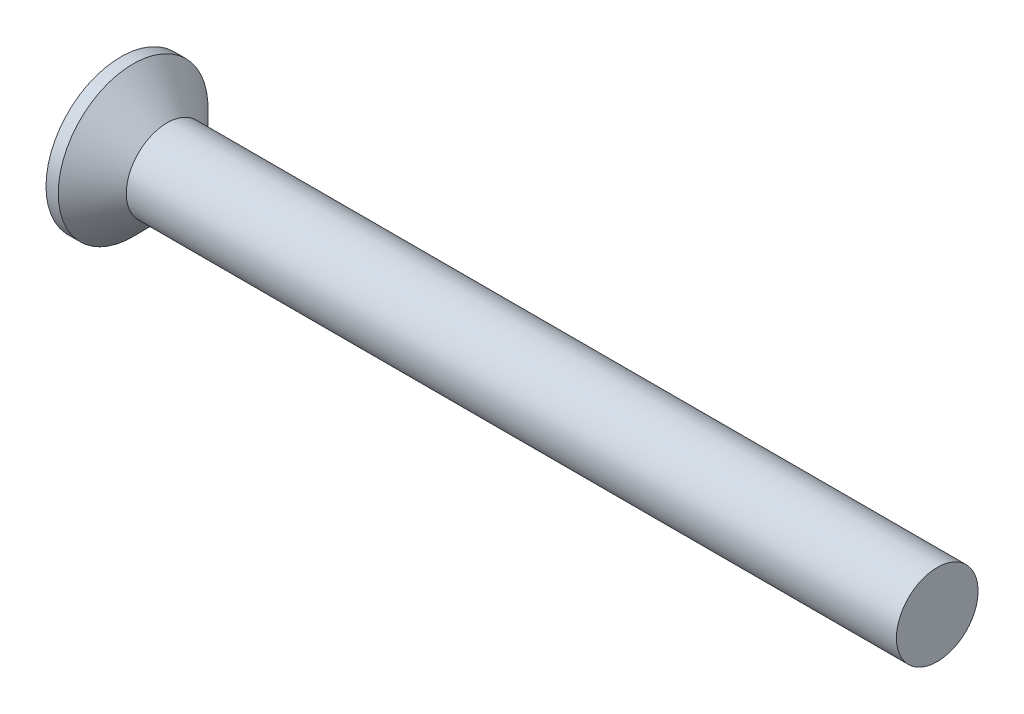
ISO-10303-21;
HEADER;
FILE_DESCRIPTION(('STEP AP214'),'2;1');
FILE_NAME('part.step','',(''),(''),'','','');
FILE_SCHEMA(('AUTOMOTIVE_DESIGN { 1 0 10303 214 1 1 1 1 }'));
ENDSEC;
DATA;
#1=APPLICATION_CONTEXT('core data for automotive mechanical design processes');
#2=APPLICATION_PROTOCOL_DEFINITION('international standard','automotive_design',2000,#1);
#3=PRODUCT_CONTEXT('',#1,'mechanical');
#4=PRODUCT('Part','Part','',(#3));
#5=PRODUCT_RELATED_PRODUCT_CATEGORY('part','',(#4));
#6=PRODUCT_DEFINITION_FORMATION('','',#4);
#7=PRODUCT_DEFINITION_CONTEXT('part definition',#1,'design');
#8=PRODUCT_DEFINITION('design','',#6,#7);
#9=PRODUCT_DEFINITION_SHAPE('','',#8);
#10=(LENGTH_UNIT() NAMED_UNIT(*) SI_UNIT(.MILLI.,.METRE.));
#11=(NAMED_UNIT(*) PLANE_ANGLE_UNIT() SI_UNIT($,.RADIAN.));
#12=(NAMED_UNIT(*) SI_UNIT($,.STERADIAN.) SOLID_ANGLE_UNIT());
#13=UNCERTAINTY_MEASURE_WITH_UNIT(LENGTH_MEASURE(1.E-05),#10,'distance_accuracy_value','');
#14=(GEOMETRIC_REPRESENTATION_CONTEXT(3) GLOBAL_UNCERTAINTY_ASSIGNED_CONTEXT((#13)) GLOBAL_UNIT_ASSIGNED_CONTEXT((#10,
#11,#12)) REPRESENTATION_CONTEXT('',''));
#15=CARTESIAN_POINT('',(0.,0.,0.));
#16=DIRECTION('',(0.,0.,1.));
#17=DIRECTION('',(1.,0.,0.));
#18=AXIS2_PLACEMENT_3D('',#15,#16,#17);
#19=CARTESIAN_POINT('',(0.,0.,0.));
#20=DIRECTION('',(-1.,0.,0.));
#21=DIRECTION('',(0.,0.,1.));
#22=AXIS2_PLACEMENT_3D('',#19,#20,#21);
#23=PLANE('',#22);
#24=CARTESIAN_POINT('',(0.,0.,0.));
#25=DIRECTION('',(-1.,0.,0.));
#26=DIRECTION('',(0.,0.,1.));
#27=AXIS2_PLACEMENT_3D('',#24,#25,#26);
#28=CIRCLE('',#27,2.75);
#29=CARTESIAN_POINT('',(0.,0.,2.75));
#30=VERTEX_POINT('',#29);
#31=EDGE_CURVE('E46',#30,#30,#28,.T.);
#32=ORIENTED_EDGE('',*,*,#31,.T.);
#33=EDGE_LOOP('',(#32));
#34=FACE_BOUND('',#33,.T.);
#35=DIRECTION('',(0.,1.,0.));
#36=VECTOR('',#35,1.);
#37=CARTESIAN_POINT('',(0.,-1.55,-0.395));
#38=LINE('',#37,#36);
#39=CARTESIAN_POINT('',(0.,-1.55,-0.395));
#40=VERTEX_POINT('',#39);
#41=CARTESIAN_POINT('',(0.,-0.394999999999999,-0.395));
#42=VERTEX_POINT('',#41);
#43=EDGE_CURVE('E107',#40,#42,#38,.T.);
#44=ORIENTED_EDGE('',*,*,#43,.T.);
#45=DIRECTION('',(0.,0.,-1.));
#46=VECTOR('',#45,1.);
#47=CARTESIAN_POINT('',(0.,-0.395000000000005,1.55));
#48=LINE('',#47,#46);
#49=CARTESIAN_POINT('',(0.,-0.394999999999995,-1.55));
#50=VERTEX_POINT('',#49);
#51=EDGE_CURVE('E87',#42,#50,#48,.T.);
#52=ORIENTED_EDGE('',*,*,#51,.T.);
#53=DIRECTION('',(0.,1.,0.));
#54=VECTOR('',#53,1.);
#55=CARTESIAN_POINT('',(0.,-0.394999999999995,-1.55));
#56=LINE('',#55,#54);
#57=CARTESIAN_POINT('',(0.,0.395000000000005,-1.55));
#58=VERTEX_POINT('',#57);
#59=EDGE_CURVE('E380',#50,#58,#56,.T.);
#60=ORIENTED_EDGE('',*,*,#59,.T.);
#61=DIRECTION('',(0.,0.,1.));
#62=VECTOR('',#61,1.);
#63=CARTESIAN_POINT('',(0.,0.395000000000005,-1.55));
#64=LINE('',#63,#62);
#65=CARTESIAN_POINT('',(0.,0.395000000000001,-0.395));
#66=VERTEX_POINT('',#65);
#67=EDGE_CURVE('E103',#58,#66,#64,.T.);
#68=ORIENTED_EDGE('',*,*,#67,.T.);
#69=CARTESIAN_POINT('',(0.,1.55,-0.395));
#70=VERTEX_POINT('',#69);
#71=EDGE_CURVE('E97',#66,#70,#38,.T.);
#72=ORIENTED_EDGE('',*,*,#71,.T.);
#73=DIRECTION('',(0.,0.,1.));
#74=VECTOR('',#73,1.);
#75=CARTESIAN_POINT('',(0.,1.55,-0.395));
#76=LINE('',#75,#74);
#77=CARTESIAN_POINT('',(0.,1.55,0.395));
#78=VERTEX_POINT('',#77);
#79=EDGE_CURVE('E100',#70,#78,#76,.T.);
#80=ORIENTED_EDGE('',*,*,#79,.T.);
#81=DIRECTION('',(0.,-1.,0.));
#82=VECTOR('',#81,1.);
#83=CARTESIAN_POINT('',(0.,1.55,0.395));
#84=LINE('',#83,#82);
#85=CARTESIAN_POINT('',(0.,0.394999999999998,0.395));
#86=VERTEX_POINT('',#85);
#87=EDGE_CURVE('E392',#78,#86,#84,.T.);
#88=ORIENTED_EDGE('',*,*,#87,.T.);
#89=CARTESIAN_POINT('',(0.,0.394999999999994,1.55));
#90=VERTEX_POINT('',#89);
#91=EDGE_CURVE('E375',#86,#90,#64,.T.);
#92=ORIENTED_EDGE('',*,*,#91,.T.);
#93=DIRECTION('',(0.,-1.,0.));
#94=VECTOR('',#93,1.);
#95=CARTESIAN_POINT('',(0.,0.394999999999994,1.55));
#96=LINE('',#95,#94);
#97=CARTESIAN_POINT('',(0.,-0.395000000000005,1.55));
#98=VERTEX_POINT('',#97);
#99=EDGE_CURVE('E361',#90,#98,#96,.T.);
#100=ORIENTED_EDGE('',*,*,#99,.T.);
#101=CARTESIAN_POINT('',(0.,-0.395000000000001,0.395));
#102=VERTEX_POINT('',#101);
#103=EDGE_CURVE('E373',#98,#102,#48,.T.);
#104=ORIENTED_EDGE('',*,*,#103,.T.);
#105=CARTESIAN_POINT('',(0.,-1.55,0.395));
#106=VERTEX_POINT('',#105);
#107=EDGE_CURVE('E113',#102,#106,#84,.T.);
#108=ORIENTED_EDGE('',*,*,#107,.T.);
#109=DIRECTION('',(0.,0.,-1.));
#110=VECTOR('',#109,1.);
#111=CARTESIAN_POINT('',(0.,-1.55,0.395));
#112=LINE('',#111,#110);
#113=EDGE_CURVE('E136',#106,#40,#112,.T.);
#114=ORIENTED_EDGE('',*,*,#113,.T.);
#115=EDGE_LOOP('',(#44,#52,#60,#68,#72,#80,#88,#92,#100,#104,#108,#114));
#116=FACE_BOUND('',#115,.T.);
#117=ADVANCED_FACE('F39',(#34,#116),#23,.T.);
#118=CARTESIAN_POINT('',(2.38373382624769,0.,0.16865988909427));
#119=DIRECTION('',(-0.0945267588569115,0.,-0.995522321125954));
#120=DIRECTION('',(-0.995522321125954,0.,0.0945267588569115));
#121=AXIS2_PLACEMENT_3D('',#118,#119,#120);
#122=PLANE('',#121);
#123=ORIENTED_EDGE('',*,*,#107,.F.);
#124=DIRECTION('',(0.991104257398676,0.0941072552097304,-0.0941072552097301));
#125=VECTOR('',#124,1.);
#126=CARTESIAN_POINT('',(2.39946475118715,-0.16716620751949,0.167166207519489));
#127=LINE('',#126,#125);
#128=CARTESIAN_POINT('',(2.08,-0.197500000000001,0.197499999999999));
#129=VERTEX_POINT('',#128);
#130=EDGE_CURVE('E131',#102,#129,#127,.T.);
#131=ORIENTED_EDGE('',*,*,#130,.T.);
#132=DIRECTION('',(0.835707904588477,0.543411029305728,-0.0793520726712617));
#133=VECTOR('',#132,1.);
#134=CARTESIAN_POINT('',(0.,-1.55,0.395));
#135=LINE('',#134,#133);
#136=EDGE_CURVE('E108',#106,#129,#135,.T.);
#137=ORIENTED_EDGE('',*,*,#136,.F.);
#138=EDGE_LOOP('',(#123,#131,#137));
#139=FACE_BOUND('',#138,.T.);
#140=ADVANCED_FACE('F159',(#139),#122,.T.);
#141=DIRECTION('',(0.835707904588477,-0.543411029305729,-0.0793520726712616));
#142=VECTOR('',#141,1.);
#143=CARTESIAN_POINT('',(0.,1.55,0.395));
#144=LINE('',#143,#142);
#145=CARTESIAN_POINT('',(2.08,0.1975,0.1975));
#146=VERTEX_POINT('',#145);
#147=EDGE_CURVE('E53',#78,#146,#144,.T.);
#148=ORIENTED_EDGE('',*,*,#147,.T.);
#149=DIRECTION('',(-0.991104257398676,0.0941072552097297,0.09410725520973));
#150=VECTOR('',#149,1.);
#151=CARTESIAN_POINT('',(2.39946475118715,0.167166207519489,0.167166207519489));
#152=LINE('',#151,#150);
#153=EDGE_CURVE('E388',#146,#86,#152,.T.);
#154=ORIENTED_EDGE('',*,*,#153,.T.);
#155=ORIENTED_EDGE('',*,*,#87,.F.);
#156=EDGE_LOOP('',(#148,#154,#155));
#157=FACE_BOUND('',#156,.T.);
#158=ADVANCED_FACE('F163',(#157),#122,.T.);
#159=CARTESIAN_POINT('',(2.38373382624769,0.,-0.16865988909427));
#160=DIRECTION('',(-0.0945267588569114,0.,0.995522321125954));
#161=DIRECTION('',(0.995522321125954,0.,0.0945267588569114));
#162=AXIS2_PLACEMENT_3D('',#159,#160,#161);
#163=PLANE('',#162);
#164=DIRECTION('',(0.835707904588477,0.543411029305729,0.0793520726712616));
#165=VECTOR('',#164,1.);
#166=CARTESIAN_POINT('',(0.,-1.55,-0.395));
#167=LINE('',#166,#165);
#168=CARTESIAN_POINT('',(2.08,-0.197499999999999,-0.197500000000001));
#169=VERTEX_POINT('',#168);
#170=EDGE_CURVE('E62',#40,#169,#167,.T.);
#171=ORIENTED_EDGE('',*,*,#170,.T.);
#172=DIRECTION('',(-0.991104257398676,-0.0941072552097297,-0.09410725520973));
#173=VECTOR('',#172,1.);
#174=CARTESIAN_POINT('',(2.39946475118715,-0.167166207519489,-0.167166207519489));
#175=LINE('',#174,#173);
#176=EDGE_CURVE('E11',#169,#42,#175,.T.);
#177=ORIENTED_EDGE('',*,*,#176,.T.);
#178=ORIENTED_EDGE('',*,*,#43,.F.);
#179=EDGE_LOOP('',(#171,#177,#178));
#180=FACE_BOUND('',#179,.T.);
#181=ADVANCED_FACE('F156',(#180),#163,.T.);
#182=ORIENTED_EDGE('',*,*,#71,.F.);
#183=DIRECTION('',(0.991104257398676,-0.0941072552097303,0.09410725520973));
#184=VECTOR('',#183,1.);
#185=CARTESIAN_POINT('',(2.39946475118715,0.16716620751949,-0.167166207519489));
#186=LINE('',#185,#184);
#187=CARTESIAN_POINT('',(2.08,0.1975,-0.1975));
#188=VERTEX_POINT('',#187);
#189=EDGE_CURVE('E116',#66,#188,#186,.T.);
#190=ORIENTED_EDGE('',*,*,#189,.T.);
#191=DIRECTION('',(0.835707904588477,-0.543411029305729,0.0793520726712616));
#192=VECTOR('',#191,1.);
#193=CARTESIAN_POINT('',(0.,1.55,-0.395));
#194=LINE('',#193,#192);
#195=EDGE_CURVE('E112',#70,#188,#194,.T.);
#196=ORIENTED_EDGE('',*,*,#195,.F.);
#197=EDGE_LOOP('',(#182,#190,#196));
#198=FACE_BOUND('',#197,.T.);
#199=ADVANCED_FACE('F115',(#198),#163,.T.);
#200=CARTESIAN_POINT('',(-6.34999999999999,0.,0.));
#201=DIRECTION('',(-1.,0.,0.));
#202=DIRECTION('',(0.,0.,1.));
#203=AXIS2_PLACEMENT_3D('',#200,#201,#202);
#204=CYLINDRICAL_SURFACE('',#203,2.75);
#205=CARTESIAN_POINT('',(0.450000000000004,0.,0.));
#206=DIRECTION('',(-1.,0.,0.));
#207=DIRECTION('',(0.,0.,1.));
#208=AXIS2_PLACEMENT_3D('',#205,#206,#207);
#209=CIRCLE('',#208,2.75);
#210=CARTESIAN_POINT('',(0.450000000000004,0.,2.75));
#211=VERTEX_POINT('',#210);
#212=EDGE_CURVE('E139',#211,#211,#209,.T.);
#213=ORIENTED_EDGE('',*,*,#212,.T.);
#214=EDGE_LOOP('',(#213));
#215=FACE_BOUND('',#214,.T.);
#216=ORIENTED_EDGE('',*,*,#31,.F.);
#217=EDGE_LOOP('',(#216));
#218=FACE_BOUND('',#217,.T.);
#219=ADVANCED_FACE('F145',(#215,#218),#204,.T.);
#220=CARTESIAN_POINT('',(0.450000000000004,0.,0.));
#221=DIRECTION('',(-1.,0.,0.));
#222=DIRECTION('',(0.,0.,1.));
#223=AXIS2_PLACEMENT_3D('',#220,#221,#222);
#224=CONICAL_SURFACE('',#223,2.75,0.78539816339745);
#225=CARTESIAN_POINT('',(1.7,0.,0.));
#226=DIRECTION('',(-1.,0.,0.));
#227=DIRECTION('',(0.,0.,1.));
#228=AXIS2_PLACEMENT_3D('',#225,#226,#227);
#229=CIRCLE('',#228,1.5);
#230=CARTESIAN_POINT('',(1.7,0.,1.5));
#231=VERTEX_POINT('',#230);
#232=EDGE_CURVE('E135',#231,#231,#229,.T.);
#233=ORIENTED_EDGE('',*,*,#232,.T.);
#234=EDGE_LOOP('',(#233));
#235=FACE_BOUND('',#234,.T.);
#236=ORIENTED_EDGE('',*,*,#212,.F.);
#237=EDGE_LOOP('',(#236));
#238=FACE_BOUND('',#237,.T.);
#239=ADVANCED_FACE('F147',(#235,#238),#224,.T.);
#240=CARTESIAN_POINT('',(-6.34999999999999,0.,0.));
#241=DIRECTION('',(-1.,0.,0.));
#242=DIRECTION('',(0.,0.,1.));
#243=AXIS2_PLACEMENT_3D('',#240,#241,#242);
#244=CYLINDRICAL_SURFACE('',#243,1.5);
#245=CARTESIAN_POINT('',(30.,0.,0.));
#246=DIRECTION('',(-1.,0.,0.));
#247=DIRECTION('',(0.,0.,1.));
#248=AXIS2_PLACEMENT_3D('',#245,#246,#247);
#249=CIRCLE('',#248,1.5);
#250=CARTESIAN_POINT('',(30.,0.,1.5));
#251=VERTEX_POINT('',#250);
#252=EDGE_CURVE('E132',#251,#251,#249,.T.);
#253=ORIENTED_EDGE('',*,*,#252,.T.);
#254=EDGE_LOOP('',(#253));
#255=FACE_BOUND('',#254,.T.);
#256=ORIENTED_EDGE('',*,*,#232,.F.);
#257=EDGE_LOOP('',(#256));
#258=FACE_BOUND('',#257,.T.);
#259=ADVANCED_FACE('F153',(#255,#258),#244,.T.);
#260=CARTESIAN_POINT('',(30.,1.5,0.));
#261=DIRECTION('',(1.,0.,0.));
#262=DIRECTION('',(0.,0.,-1.));
#263=AXIS2_PLACEMENT_3D('',#260,#261,#262);
#264=PLANE('',#263);
#265=ORIENTED_EDGE('',*,*,#252,.F.);
#266=EDGE_LOOP('',(#265));
#267=FACE_BOUND('',#266,.T.);
#268=ADVANCED_FACE('F183',(#267),#264,.T.);
#269=CARTESIAN_POINT('',(2.08,-0.1975,-0.1975));
#270=DIRECTION('',(-1.,0.,0.));
#271=DIRECTION('',(0.,0.,1.));
#272=AXIS2_PLACEMENT_3D('',#269,#270,#271);
#273=PLANE('',#272);
#274=DIRECTION('',(0.,1.,0.));
#275=VECTOR('',#274,1.);
#276=CARTESIAN_POINT('',(2.08,-0.1975,-0.1975));
#277=LINE('',#276,#275);
#278=EDGE_CURVE('E127',#169,#188,#277,.T.);
#279=ORIENTED_EDGE('',*,*,#278,.F.);
#280=DIRECTION('',(0.,0.,-1.));
#281=VECTOR('',#280,1.);
#282=CARTESIAN_POINT('',(2.08,-0.1975,0.1975));
#283=LINE('',#282,#281);
#284=EDGE_CURVE('E118',#129,#169,#283,.T.);
#285=ORIENTED_EDGE('',*,*,#284,.F.);
#286=DIRECTION('',(0.,-1.,0.));
#287=VECTOR('',#286,1.);
#288=CARTESIAN_POINT('',(2.08,0.1975,0.1975));
#289=LINE('',#288,#287);
#290=EDGE_CURVE('E121',#146,#129,#289,.T.);
#291=ORIENTED_EDGE('',*,*,#290,.F.);
#292=DIRECTION('',(0.,0.,1.));
#293=VECTOR('',#292,1.);
#294=CARTESIAN_POINT('',(2.08,0.1975,-0.1975));
#295=LINE('',#294,#293);
#296=EDGE_CURVE('E125',#188,#146,#295,.T.);
#297=ORIENTED_EDGE('',*,*,#296,.F.);
#298=EDGE_LOOP('',(#279,#285,#291,#297));
#299=FACE_BOUND('',#298,.T.);
#300=ADVANCED_FACE('F180',(#299),#273,.T.);
#301=CARTESIAN_POINT('',(0.,-1.55,-0.395));
#302=DIRECTION('',(-0.54513001368185,0.838351518268576,0.));
#303=DIRECTION('',(-0.838351518268576,-0.54513001368185,0.));
#304=AXIS2_PLACEMENT_3D('',#301,#302,#303);
#305=PLANE('',#304);
#306=ORIENTED_EDGE('',*,*,#170,.F.);
#307=ORIENTED_EDGE('',*,*,#113,.F.);
#308=ORIENTED_EDGE('',*,*,#136,.T.);
#309=ORIENTED_EDGE('',*,*,#284,.T.);
#310=EDGE_LOOP('',(#306,#307,#308,#309));
#311=FACE_BOUND('',#310,.T.);
#312=ADVANCED_FACE('F172',(#311),#305,.T.);
#313=CARTESIAN_POINT('',(0.,1.55,0.395));
#314=DIRECTION('',(-0.54513001368185,-0.838351518268576,0.));
#315=DIRECTION('',(0.838351518268576,-0.54513001368185,0.));
#316=AXIS2_PLACEMENT_3D('',#313,#314,#315);
#317=PLANE('',#316);
#318=ORIENTED_EDGE('',*,*,#147,.F.);
#319=ORIENTED_EDGE('',*,*,#79,.F.);
#320=ORIENTED_EDGE('',*,*,#195,.T.);
#321=ORIENTED_EDGE('',*,*,#296,.T.);
#322=EDGE_LOOP('',(#318,#319,#320,#321));
#323=FACE_BOUND('',#322,.T.);
#324=ADVANCED_FACE('F111',(#323),#317,.T.);
#325=CARTESIAN_POINT('',(2.38373382624769,-0.16865988909427,0.));
#326=DIRECTION('',(-0.0945267588569115,0.995522321125954,0.));
#327=DIRECTION('',(-0.995522321125954,-0.0945267588569115,0.));
#328=AXIS2_PLACEMENT_3D('',#325,#326,#327);
#329=PLANE('',#328);
#330=DIRECTION('',(0.835707904588477,0.0793520726712598,0.543411029305729));
#331=VECTOR('',#330,1.);
#332=CARTESIAN_POINT('',(0.,-0.394999999999995,-1.55));
#333=LINE('',#332,#331);
#334=EDGE_CURVE('E382',#50,#169,#333,.T.);
#335=ORIENTED_EDGE('',*,*,#334,.F.);
#336=ORIENTED_EDGE('',*,*,#51,.F.);
#337=ORIENTED_EDGE('',*,*,#176,.F.);
#338=EDGE_LOOP('',(#335,#336,#337));
#339=FACE_BOUND('',#338,.T.);
#340=ADVANCED_FACE('F179',(#339),#329,.T.);
#341=CARTESIAN_POINT('',(2.38373382624769,0.16865988909427,0.));
#342=DIRECTION('',(-0.0945267588569114,-0.995522321125954,0.));
#343=DIRECTION('',(0.995522321125954,-0.0945267588569114,0.));
#344=AXIS2_PLACEMENT_3D('',#341,#342,#343);
#345=PLANE('',#344);
#346=ORIENTED_EDGE('',*,*,#67,.F.);
#347=DIRECTION('',(0.835707904588477,-0.0793520726712635,0.543411029305728));
#348=VECTOR('',#347,1.);
#349=CARTESIAN_POINT('',(0.,0.395000000000005,-1.55));
#350=LINE('',#349,#348);
#351=EDGE_CURVE('E78',#58,#188,#350,.T.);
#352=ORIENTED_EDGE('',*,*,#351,.T.);
#353=ORIENTED_EDGE('',*,*,#189,.F.);
#354=EDGE_LOOP('',(#346,#352,#353));
#355=FACE_BOUND('',#354,.T.);
#356=ADVANCED_FACE('F223',(#355),#345,.T.);
#357=CARTESIAN_POINT('',(0.,0.395000000000005,-1.55));
#358=DIRECTION('',(-0.54513001368185,0.,0.838351518268576));
#359=DIRECTION('',(-0.838351518268576,0.,-0.54513001368185));
#360=AXIS2_PLACEMENT_3D('',#357,#358,#359);
#361=PLANE('',#360);
#362=ORIENTED_EDGE('',*,*,#351,.F.);
#363=ORIENTED_EDGE('',*,*,#59,.F.);
#364=ORIENTED_EDGE('',*,*,#334,.T.);
#365=ORIENTED_EDGE('',*,*,#278,.T.);
#366=EDGE_LOOP('',(#362,#363,#364,#365));
#367=FACE_BOUND('',#366,.T.);
#368=ADVANCED_FACE('F231',(#367),#361,.T.);
#369=ORIENTED_EDGE('',*,*,#103,.F.);
#370=DIRECTION('',(0.835707904588477,0.0793520726712635,-0.543411029305728));
#371=VECTOR('',#370,1.);
#372=CARTESIAN_POINT('',(0.,-0.395000000000005,1.55));
#373=LINE('',#372,#371);
#374=EDGE_CURVE('E358',#98,#129,#373,.T.);
#375=ORIENTED_EDGE('',*,*,#374,.T.);
#376=ORIENTED_EDGE('',*,*,#130,.F.);
#377=EDGE_LOOP('',(#369,#375,#376));
#378=FACE_BOUND('',#377,.T.);
#379=ADVANCED_FACE('F225',(#378),#329,.T.);
#380=DIRECTION('',(0.835707904588477,-0.0793520726712597,-0.543411029305729));
#381=VECTOR('',#380,1.);
#382=CARTESIAN_POINT('',(0.,0.394999999999994,1.55));
#383=LINE('',#382,#381);
#384=EDGE_CURVE('E369',#90,#146,#383,.T.);
#385=ORIENTED_EDGE('',*,*,#384,.F.);
#386=ORIENTED_EDGE('',*,*,#91,.F.);
#387=ORIENTED_EDGE('',*,*,#153,.F.);
#388=EDGE_LOOP('',(#385,#386,#387));
#389=FACE_BOUND('',#388,.T.);
#390=ADVANCED_FACE('F233',(#389),#345,.T.);
#391=CARTESIAN_POINT('',(0.,-0.395000000000005,1.55));
#392=DIRECTION('',(-0.54513001368185,0.,-0.838351518268576));
#393=DIRECTION('',(0.838351518268576,0.,-0.54513001368185));
#394=AXIS2_PLACEMENT_3D('',#391,#392,#393);
#395=PLANE('',#394);
#396=ORIENTED_EDGE('',*,*,#374,.F.);
#397=ORIENTED_EDGE('',*,*,#99,.F.);
#398=ORIENTED_EDGE('',*,*,#384,.T.);
#399=ORIENTED_EDGE('',*,*,#290,.T.);
#400=EDGE_LOOP('',(#396,#397,#398,#399));
#401=FACE_BOUND('',#400,.T.);
#402=ADVANCED_FACE('F252',(#401),#395,.T.);
#403=CLOSED_SHELL('',(#117,#140,#158,#181,#199,#219,#239,#259,#268,#300,#312,#324,#340,#356,
#368,#379,#390,#402));
#404=MANIFOLD_SOLID_BREP('B2',#403);
#405=ADVANCED_BREP_SHAPE_REPRESENTATION('',(#18,#404),#14);
#406=SHAPE_DEFINITION_REPRESENTATION(#9,#405);
ENDSEC;
END-ISO-10303-21;
